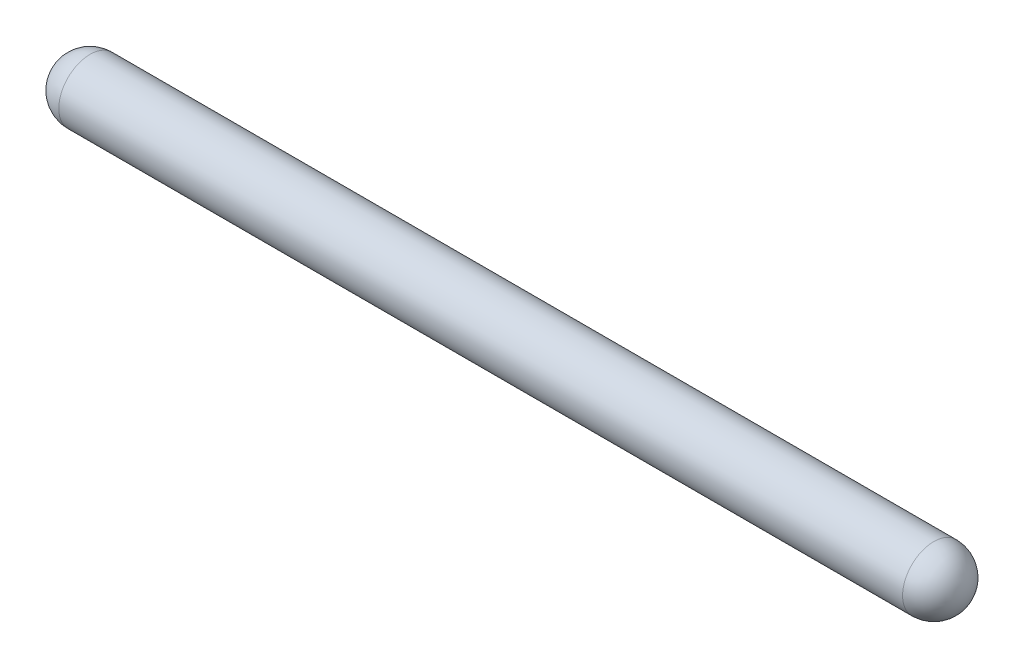
ISO-10303-21;
HEADER;
FILE_DESCRIPTION(('STEP AP214'),'2;1');
FILE_NAME('part.step','',(''),(''),'','','');
FILE_SCHEMA(('AUTOMOTIVE_DESIGN { 1 0 10303 214 1 1 1 1 }'));
ENDSEC;
DATA;
#1=APPLICATION_CONTEXT('core data for automotive mechanical design processes');
#2=APPLICATION_PROTOCOL_DEFINITION('international standard','automotive_design',2000,#1);
#3=PRODUCT_CONTEXT('',#1,'mechanical');
#4=PRODUCT('Part','Part','',(#3));
#5=PRODUCT_RELATED_PRODUCT_CATEGORY('part','',(#4));
#6=PRODUCT_DEFINITION_FORMATION('','',#4);
#7=PRODUCT_DEFINITION_CONTEXT('part definition',#1,'design');
#8=PRODUCT_DEFINITION('design','',#6,#7);
#9=PRODUCT_DEFINITION_SHAPE('','',#8);
#10=(LENGTH_UNIT() NAMED_UNIT(*) SI_UNIT(.MILLI.,.METRE.));
#11=(NAMED_UNIT(*) PLANE_ANGLE_UNIT() SI_UNIT($,.RADIAN.));
#12=(NAMED_UNIT(*) SI_UNIT($,.STERADIAN.) SOLID_ANGLE_UNIT());
#13=UNCERTAINTY_MEASURE_WITH_UNIT(LENGTH_MEASURE(1.E-05),#10,'distance_accuracy_value','');
#14=(GEOMETRIC_REPRESENTATION_CONTEXT(3) GLOBAL_UNCERTAINTY_ASSIGNED_CONTEXT((#13)) GLOBAL_UNIT_ASSIGNED_CONTEXT((#10,
#11,#12)) REPRESENTATION_CONTEXT('',''));
#15=CARTESIAN_POINT('',(0.,0.,0.));
#16=DIRECTION('',(0.,0.,1.));
#17=DIRECTION('',(1.,0.,0.));
#18=AXIS2_PLACEMENT_3D('',#15,#16,#17);
#19=CARTESIAN_POINT('',(58.,0.,0.));
#20=DIRECTION('',(-1.,0.,0.));
#21=DIRECTION('',(0.,0.,1.));
#22=AXIS2_PLACEMENT_3D('',#19,#20,#21);
#23=CYLINDRICAL_SURFACE('',#22,2.);
#24=CARTESIAN_POINT('',(2.,0.,0.));
#25=DIRECTION('',(-1.,0.,0.));
#26=DIRECTION('',(0.,0.,1.));
#27=AXIS2_PLACEMENT_3D('',#24,#25,#26);
#28=CIRCLE('',#27,2.);
#29=CARTESIAN_POINT('',(2.,0.,2.));
#30=VERTEX_POINT('',#29);
#31=EDGE_CURVE('E10',#30,#30,#28,.F.);
#32=ORIENTED_EDGE('',*,*,#31,.T.);
#33=EDGE_LOOP('',(#32));
#34=FACE_BOUND('',#33,.T.);
#35=CARTESIAN_POINT('',(56.,0.,0.));
#36=DIRECTION('',(-1.,0.,0.));
#37=DIRECTION('',(0.,0.,1.));
#38=AXIS2_PLACEMENT_3D('',#35,#36,#37);
#39=CIRCLE('',#38,2.);
#40=CARTESIAN_POINT('',(56.,0.,2.));
#41=VERTEX_POINT('',#40);
#42=EDGE_CURVE('E22',#41,#41,#39,.T.);
#43=ORIENTED_EDGE('',*,*,#42,.T.);
#44=EDGE_LOOP('',(#43));
#45=FACE_BOUND('',#44,.T.);
#46=ADVANCED_FACE('F15',(#34,#45),#23,.T.);
#47=CARTESIAN_POINT('',(2.,0.,0.));
#48=DIRECTION('',(1.,0.,0.));
#49=DIRECTION('',(0.,0.,-1.));
#50=AXIS2_PLACEMENT_3D('',#47,#48,#49);
#51=SPHERICAL_SURFACE('',#50,2.);
#52=ORIENTED_EDGE('',*,*,#31,.F.);
#53=EDGE_LOOP('',(#52));
#54=FACE_BOUND('',#53,.T.);
#55=ADVANCED_FACE('F30',(#54),#51,.T.);
#56=CARTESIAN_POINT('',(56.,0.,0.));
#57=DIRECTION('',(1.,0.,0.));
#58=DIRECTION('',(0.,0.,-1.));
#59=AXIS2_PLACEMENT_3D('',#56,#57,#58);
#60=SPHERICAL_SURFACE('',#59,2.);
#61=ORIENTED_EDGE('',*,*,#42,.F.);
#62=EDGE_LOOP('',(#61));
#63=FACE_BOUND('',#62,.T.);
#64=ADVANCED_FACE('F17',(#63),#60,.T.);
#65=CLOSED_SHELL('',(#46,#55,#64));
#66=MANIFOLD_SOLID_BREP('B1',#65);
#67=ADVANCED_BREP_SHAPE_REPRESENTATION('',(#18,#66),#14);
#68=SHAPE_DEFINITION_REPRESENTATION(#9,#67);
ENDSEC;
END-ISO-10303-21;
